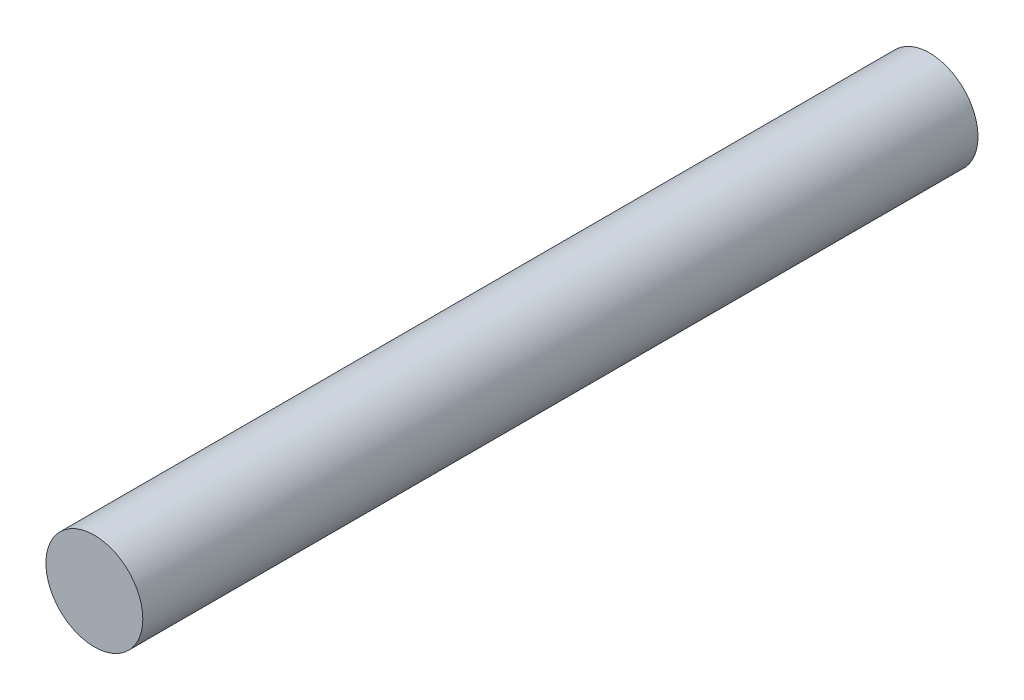
ISO-10303-21;
HEADER;
FILE_DESCRIPTION(('STEP AP214'),'2;1');
FILE_NAME('part.step','',(''),(''),'','','');
FILE_SCHEMA(('AUTOMOTIVE_DESIGN { 1 0 10303 214 1 1 1 1 }'));
ENDSEC;
DATA;
#1=APPLICATION_CONTEXT('core data for automotive mechanical design processes');
#2=APPLICATION_PROTOCOL_DEFINITION('international standard','automotive_design',2000,#1);
#3=PRODUCT_CONTEXT('',#1,'mechanical');
#4=PRODUCT('Part','Part','',(#3));
#5=PRODUCT_RELATED_PRODUCT_CATEGORY('part','',(#4));
#6=PRODUCT_DEFINITION_FORMATION('','',#4);
#7=PRODUCT_DEFINITION_CONTEXT('part definition',#1,'design');
#8=PRODUCT_DEFINITION('design','',#6,#7);
#9=PRODUCT_DEFINITION_SHAPE('','',#8);
#10=(LENGTH_UNIT() NAMED_UNIT(*) SI_UNIT(.MILLI.,.METRE.));
#11=(NAMED_UNIT(*) PLANE_ANGLE_UNIT() SI_UNIT($,.RADIAN.));
#12=(NAMED_UNIT(*) SI_UNIT($,.STERADIAN.) SOLID_ANGLE_UNIT());
#13=UNCERTAINTY_MEASURE_WITH_UNIT(LENGTH_MEASURE(1.E-05),#10,'distance_accuracy_value','');
#14=(GEOMETRIC_REPRESENTATION_CONTEXT(3) GLOBAL_UNCERTAINTY_ASSIGNED_CONTEXT((#13)) GLOBAL_UNIT_ASSIGNED_CONTEXT((#10,
#11,#12)) REPRESENTATION_CONTEXT('',''));
#15=CARTESIAN_POINT('',(0.,0.,0.));
#16=DIRECTION('',(0.,0.,1.));
#17=DIRECTION('',(1.,0.,0.));
#18=AXIS2_PLACEMENT_3D('',#15,#16,#17);
#19=CARTESIAN_POINT('',(0.,0.,82.55));
#20=DIRECTION('',(0.,0.,-1.));
#21=DIRECTION('',(-1.,0.,0.));
#22=AXIS2_PLACEMENT_3D('',#19,#20,#21);
#23=CYLINDRICAL_SURFACE('',#22,4.7879);
#24=CARTESIAN_POINT('',(0.,0.,82.55));
#25=DIRECTION('',(0.,0.,1.));
#26=DIRECTION('',(1.,0.,0.));
#27=AXIS2_PLACEMENT_3D('',#24,#25,#26);
#28=CIRCLE('',#27,4.7879);
#29=CARTESIAN_POINT('',(4.7879,0.,82.55));
#30=VERTEX_POINT('',#29);
#31=EDGE_CURVE('E10',#30,#30,#28,.T.);
#32=ORIENTED_EDGE('',*,*,#31,.F.);
#33=EDGE_LOOP('',(#32));
#34=FACE_BOUND('',#33,.T.);
#35=CARTESIAN_POINT('',(0.,0.,0.));
#36=DIRECTION('',(0.,0.,1.));
#37=DIRECTION('',(1.,0.,0.));
#38=AXIS2_PLACEMENT_3D('',#35,#36,#37);
#39=CIRCLE('',#38,4.7879);
#40=CARTESIAN_POINT('',(4.7879,0.,0.));
#41=VERTEX_POINT('',#40);
#42=EDGE_CURVE('E34',#41,#41,#39,.T.);
#43=ORIENTED_EDGE('',*,*,#42,.T.);
#44=EDGE_LOOP('',(#43));
#45=FACE_BOUND('',#44,.T.);
#46=ADVANCED_FACE('F31',(#34,#45),#23,.T.);
#47=CARTESIAN_POINT('',(0.,0.,82.55));
#48=DIRECTION('',(0.,0.,1.));
#49=DIRECTION('',(1.,0.,0.));
#50=AXIS2_PLACEMENT_3D('',#47,#48,#49);
#51=PLANE('',#50);
#52=ORIENTED_EDGE('',*,*,#31,.T.);
#53=EDGE_LOOP('',(#52));
#54=FACE_BOUND('',#53,.T.);
#55=ADVANCED_FACE('F46',(#54),#51,.T.);
#56=CARTESIAN_POINT('',(0.,0.,0.));
#57=DIRECTION('',(0.,0.,1.));
#58=DIRECTION('',(1.,0.,0.));
#59=AXIS2_PLACEMENT_3D('',#56,#57,#58);
#60=PLANE('',#59);
#61=ORIENTED_EDGE('',*,*,#42,.F.);
#62=EDGE_LOOP('',(#61));
#63=FACE_BOUND('',#62,.T.);
#64=ADVANCED_FACE('F44',(#63),#60,.F.);
#65=CLOSED_SHELL('',(#46,#55,#64));
#66=MANIFOLD_SOLID_BREP('B2',#65);
#67=ADVANCED_BREP_SHAPE_REPRESENTATION('',(#18,#66),#14);
#68=SHAPE_DEFINITION_REPRESENTATION(#9,#67);
ENDSEC;
END-ISO-10303-21;
